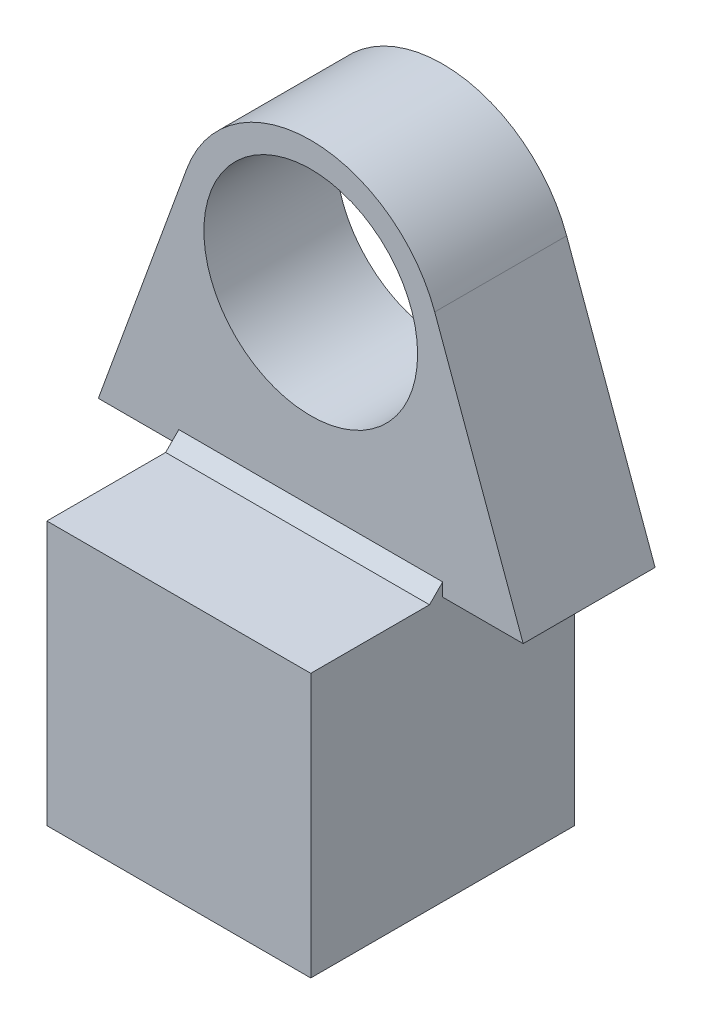
ISO-10303-21;
HEADER;
FILE_DESCRIPTION(('STEP AP214'),'2;1');
FILE_NAME('part.step','',(''),(''),'','','');
FILE_SCHEMA(('AUTOMOTIVE_DESIGN { 1 0 10303 214 1 1 1 1 }'));
ENDSEC;
DATA;
#1=APPLICATION_CONTEXT('core data for automotive mechanical design processes');
#2=APPLICATION_PROTOCOL_DEFINITION('international standard','automotive_design',2000,#1);
#3=PRODUCT_CONTEXT('',#1,'mechanical');
#4=PRODUCT('Part','Part','',(#3));
#5=PRODUCT_RELATED_PRODUCT_CATEGORY('part','',(#4));
#6=PRODUCT_DEFINITION_FORMATION('','',#4);
#7=PRODUCT_DEFINITION_CONTEXT('part definition',#1,'design');
#8=PRODUCT_DEFINITION('design','',#6,#7);
#9=PRODUCT_DEFINITION_SHAPE('','',#8);
#10=(LENGTH_UNIT() NAMED_UNIT(*) SI_UNIT(.MILLI.,.METRE.));
#11=(NAMED_UNIT(*) PLANE_ANGLE_UNIT() SI_UNIT($,.RADIAN.));
#12=(NAMED_UNIT(*) SI_UNIT($,.STERADIAN.) SOLID_ANGLE_UNIT());
#13=UNCERTAINTY_MEASURE_WITH_UNIT(LENGTH_MEASURE(1.E-05),#10,'distance_accuracy_value','');
#14=(GEOMETRIC_REPRESENTATION_CONTEXT(3) GLOBAL_UNCERTAINTY_ASSIGNED_CONTEXT((#13)) GLOBAL_UNIT_ASSIGNED_CONTEXT((#10,
#11,#12)) REPRESENTATION_CONTEXT('',''));
#15=CARTESIAN_POINT('',(0.,0.,0.));
#16=DIRECTION('',(0.,0.,1.));
#17=DIRECTION('',(1.,0.,0.));
#18=AXIS2_PLACEMENT_3D('',#15,#16,#17);
#19=CARTESIAN_POINT('',(0.,-15.,-10.));
#20=DIRECTION('',(0.,-1.,0.));
#21=DIRECTION('',(1.,0.,0.));
#22=AXIS2_PLACEMENT_3D('',#19,#20,#21);
#23=PLANE('',#22);
#24=DIRECTION('',(0.,0.,1.));
#25=VECTOR('',#24,1.);
#26=CARTESIAN_POINT('',(16.1013312387521,-15.,-10.));
#27=LINE('',#26,#25);
#28=CARTESIAN_POINT('',(16.1013312387521,-15.,-10.));
#29=VERTEX_POINT('',#28);
#30=CARTESIAN_POINT('',(16.1013312387521,-15.,0.));
#31=VERTEX_POINT('',#30);
#32=EDGE_CURVE('E140',#29,#31,#27,.T.);
#33=ORIENTED_EDGE('',*,*,#32,.T.);
#34=DIRECTION('',(-1.,0.,0.));
#35=VECTOR('',#34,1.);
#36=CARTESIAN_POINT('',(-16.1013312387521,-15.,0.));
#37=LINE('',#36,#35);
#38=CARTESIAN_POINT('',(10.,-15.,0.));
#39=VERTEX_POINT('',#38);
#40=EDGE_CURVE('E121',#31,#39,#37,.T.);
#41=ORIENTED_EDGE('',*,*,#40,.T.);
#42=DIRECTION('',(0.,0.,1.));
#43=VECTOR('',#42,1.);
#44=CARTESIAN_POINT('',(10.,-15.,-10.));
#45=LINE('',#44,#43);
#46=CARTESIAN_POINT('',(10.,-15.,-10.));
#47=VERTEX_POINT('',#46);
#48=EDGE_CURVE('E203',#47,#39,#45,.T.);
#49=ORIENTED_EDGE('',*,*,#48,.F.);
#50=DIRECTION('',(1.,0.,0.));
#51=VECTOR('',#50,1.);
#52=CARTESIAN_POINT('',(0.,-15.,-10.));
#53=LINE('',#52,#51);
#54=EDGE_CURVE('E147',#47,#29,#53,.T.);
#55=ORIENTED_EDGE('',*,*,#54,.T.);
#56=EDGE_LOOP('',(#33,#41,#49,#55));
#57=FACE_BOUND('',#56,.T.);
#58=ADVANCED_FACE('F41',(#57),#23,.T.);
#59=CARTESIAN_POINT('',(0.,0.,-10.));
#60=DIRECTION('',(0.,0.,1.));
#61=DIRECTION('',(1.,0.,0.));
#62=AXIS2_PLACEMENT_3D('',#59,#60,#61);
#63=CYLINDRICAL_SURFACE('',#62,10.);
#64=CARTESIAN_POINT('',(0.,0.,0.));
#65=DIRECTION('',(0.,0.,1.));
#66=DIRECTION('',(1.,0.,0.));
#67=AXIS2_PLACEMENT_3D('',#64,#65,#66);
#68=CIRCLE('',#67,10.);
#69=CARTESIAN_POINT('',(-9.3969262078591,3.42020143325666,0.));
#70=VERTEX_POINT('',#69);
#71=CARTESIAN_POINT('',(9.39692620785909,3.42020143325666,0.));
#72=VERTEX_POINT('',#71);
#73=EDGE_CURVE('E144',#70,#72,#68,.F.);
#74=ORIENTED_EDGE('',*,*,#73,.T.);
#75=DIRECTION('',(0.,0.,1.));
#76=VECTOR('',#75,1.);
#77=CARTESIAN_POINT('',(9.39692620785909,3.42020143325666,-10.));
#78=LINE('',#77,#76);
#79=CARTESIAN_POINT('',(9.39692620785909,3.42020143325666,-10.));
#80=VERTEX_POINT('',#79);
#81=EDGE_CURVE('E141',#80,#72,#78,.T.);
#82=ORIENTED_EDGE('',*,*,#81,.F.);
#83=CARTESIAN_POINT('',(0.,0.,-10.));
#84=DIRECTION('',(0.,0.,1.));
#85=DIRECTION('',(1.,0.,0.));
#86=AXIS2_PLACEMENT_3D('',#83,#84,#85);
#87=CIRCLE('',#86,10.);
#88=CARTESIAN_POINT('',(-9.3969262078591,3.42020143325666,-10.));
#89=VERTEX_POINT('',#88);
#90=EDGE_CURVE('E242',#80,#89,#87,.T.);
#91=ORIENTED_EDGE('',*,*,#90,.T.);
#92=DIRECTION('',(0.,0.,1.));
#93=VECTOR('',#92,1.);
#94=CARTESIAN_POINT('',(-9.3969262078591,3.42020143325666,-10.));
#95=LINE('',#94,#93);
#96=EDGE_CURVE('E157',#89,#70,#95,.T.);
#97=ORIENTED_EDGE('',*,*,#96,.T.);
#98=EDGE_LOOP('',(#74,#82,#91,#97));
#99=FACE_BOUND('',#98,.T.);
#100=ADVANCED_FACE('F261',(#99),#63,.T.);
#101=CARTESIAN_POINT('',(9.39692620785909,3.42020143325666,-10.));
#102=DIRECTION('',(-0.939692620785909,-0.342020143325666,0.));
#103=DIRECTION('',(0.342020143325666,-0.939692620785909,0.));
#104=AXIS2_PLACEMENT_3D('',#101,#102,#103);
#105=PLANE('',#104);
#106=DIRECTION('',(-0.342020143325666,0.939692620785909,0.));
#107=VECTOR('',#106,1.);
#108=CARTESIAN_POINT('',(9.39692620785909,3.42020143325666,0.));
#109=LINE('',#108,#107);
#110=EDGE_CURVE('E125',#31,#72,#109,.T.);
#111=ORIENTED_EDGE('',*,*,#110,.F.);
#112=ORIENTED_EDGE('',*,*,#32,.F.);
#113=DIRECTION('',(0.342020143325666,-0.939692620785909,0.));
#114=VECTOR('',#113,1.);
#115=CARTESIAN_POINT('',(9.39692620785909,3.42020143325666,-10.));
#116=LINE('',#115,#114);
#117=EDGE_CURVE('E164',#80,#29,#116,.T.);
#118=ORIENTED_EDGE('',*,*,#117,.F.);
#119=ORIENTED_EDGE('',*,*,#81,.T.);
#120=EDGE_LOOP('',(#111,#112,#118,#119));
#121=FACE_BOUND('',#120,.T.);
#122=ADVANCED_FACE('F138',(#121),#105,.F.);
#123=DIRECTION('',(0.,0.,-1.));
#124=VECTOR('',#123,1.);
#125=CARTESIAN_POINT('',(-10.,-15.,-10.));
#126=LINE('',#125,#124);
#127=CARTESIAN_POINT('',(-10.,-15.,0.));
#128=VERTEX_POINT('',#127);
#129=CARTESIAN_POINT('',(-10.,-15.,-10.));
#130=VERTEX_POINT('',#129);
#131=EDGE_CURVE('E221',#128,#130,#126,.T.);
#132=ORIENTED_EDGE('',*,*,#131,.F.);
#133=CARTESIAN_POINT('',(-16.1013312387521,-15.,0.));
#134=VERTEX_POINT('',#133);
#135=EDGE_CURVE('E134',#128,#134,#37,.T.);
#136=ORIENTED_EDGE('',*,*,#135,.T.);
#137=DIRECTION('',(0.,0.,1.));
#138=VECTOR('',#137,1.);
#139=CARTESIAN_POINT('',(-16.1013312387521,-15.,-10.));
#140=LINE('',#139,#138);
#141=CARTESIAN_POINT('',(-16.1013312387521,-15.,-10.));
#142=VERTEX_POINT('',#141);
#143=EDGE_CURVE('E150',#142,#134,#140,.T.);
#144=ORIENTED_EDGE('',*,*,#143,.F.);
#145=EDGE_CURVE('E249',#142,#130,#53,.T.);
#146=ORIENTED_EDGE('',*,*,#145,.T.);
#147=EDGE_LOOP('',(#132,#136,#144,#146));
#148=FACE_BOUND('',#147,.T.);
#149=ADVANCED_FACE('F266',(#148),#23,.T.);
#150=CARTESIAN_POINT('',(-9.3969262078591,3.42020143325666,-10.));
#151=DIRECTION('',(0.93969262078591,-0.342020143325665,0.));
#152=DIRECTION('',(0.342020143325665,0.93969262078591,0.));
#153=AXIS2_PLACEMENT_3D('',#150,#151,#152);
#154=PLANE('',#153);
#155=DIRECTION('',(-0.342020143325665,-0.93969262078591,0.));
#156=VECTOR('',#155,1.);
#157=CARTESIAN_POINT('',(-9.3969262078591,3.42020143325666,0.));
#158=LINE('',#157,#156);
#159=EDGE_CURVE('E192',#70,#134,#158,.T.);
#160=ORIENTED_EDGE('',*,*,#159,.F.);
#161=ORIENTED_EDGE('',*,*,#96,.F.);
#162=DIRECTION('',(0.342020143325665,0.93969262078591,0.));
#163=VECTOR('',#162,1.);
#164=CARTESIAN_POINT('',(-9.3969262078591,3.42020143325666,-10.));
#165=LINE('',#164,#163);
#166=EDGE_CURVE('E246',#142,#89,#165,.T.);
#167=ORIENTED_EDGE('',*,*,#166,.F.);
#168=ORIENTED_EDGE('',*,*,#143,.T.);
#169=EDGE_LOOP('',(#160,#161,#167,#168));
#170=FACE_BOUND('',#169,.T.);
#171=ADVANCED_FACE('F264',(#170),#154,.F.);
#172=CARTESIAN_POINT('',(0.,0.,-10.));
#173=DIRECTION('',(0.,0.,1.));
#174=DIRECTION('',(1.,0.,0.));
#175=AXIS2_PLACEMENT_3D('',#172,#173,#174);
#176=CYLINDRICAL_SURFACE('',#175,8.1);
#177=CARTESIAN_POINT('',(0.,0.,-10.));
#178=DIRECTION('',(0.,0.,1.));
#179=DIRECTION('',(1.,0.,0.));
#180=AXIS2_PLACEMENT_3D('',#177,#178,#179);
#181=CIRCLE('',#180,8.1);
#182=CARTESIAN_POINT('',(8.1,0.,-10.));
#183=VERTEX_POINT('',#182);
#184=EDGE_CURVE('E238',#183,#183,#181,.T.);
#185=ORIENTED_EDGE('',*,*,#184,.F.);
#186=EDGE_LOOP('',(#185));
#187=FACE_BOUND('',#186,.T.);
#188=CARTESIAN_POINT('',(0.,0.,0.));
#189=DIRECTION('',(0.,0.,1.));
#190=DIRECTION('',(1.,0.,0.));
#191=AXIS2_PLACEMENT_3D('',#188,#189,#190);
#192=CIRCLE('',#191,8.1);
#193=CARTESIAN_POINT('',(8.1,0.,0.));
#194=VERTEX_POINT('',#193);
#195=EDGE_CURVE('E143',#194,#194,#192,.F.);
#196=ORIENTED_EDGE('',*,*,#195,.F.);
#197=EDGE_LOOP('',(#196));
#198=FACE_BOUND('',#197,.T.);
#199=ADVANCED_FACE('F288',(#187,#198),#176,.F.);
#200=CARTESIAN_POINT('',(0.,0.,-10.));
#201=DIRECTION('',(0.,0.,1.));
#202=DIRECTION('',(1.,0.,0.));
#203=AXIS2_PLACEMENT_3D('',#200,#201,#202);
#204=PLANE('',#203);
#205=ORIENTED_EDGE('',*,*,#184,.T.);
#206=EDGE_LOOP('',(#205));
#207=FACE_BOUND('',#206,.T.);
#208=ORIENTED_EDGE('',*,*,#90,.F.);
#209=ORIENTED_EDGE('',*,*,#117,.T.);
#210=ORIENTED_EDGE('',*,*,#54,.F.);
#211=DIRECTION('',(0.,1.,0.));
#212=VECTOR('',#211,1.);
#213=CARTESIAN_POINT('',(10.,-35.,-10.));
#214=LINE('',#213,#212);
#215=CARTESIAN_POINT('',(10.,-35.,-10.));
#216=VERTEX_POINT('',#215);
#217=EDGE_CURVE('E218',#216,#47,#214,.T.);
#218=ORIENTED_EDGE('',*,*,#217,.F.);
#219=DIRECTION('',(1.,0.,0.));
#220=VECTOR('',#219,1.);
#221=CARTESIAN_POINT('',(10.,-35.,-10.));
#222=LINE('',#221,#220);
#223=CARTESIAN_POINT('',(-10.,-35.,-10.));
#224=VERTEX_POINT('',#223);
#225=EDGE_CURVE('E215',#224,#216,#222,.T.);
#226=ORIENTED_EDGE('',*,*,#225,.F.);
#227=DIRECTION('',(0.,1.,0.));
#228=VECTOR('',#227,1.);
#229=CARTESIAN_POINT('',(-10.,-35.,-10.));
#230=LINE('',#229,#228);
#231=EDGE_CURVE('E227',#224,#130,#230,.T.);
#232=ORIENTED_EDGE('',*,*,#231,.T.);
#233=ORIENTED_EDGE('',*,*,#145,.F.);
#234=ORIENTED_EDGE('',*,*,#166,.T.);
#235=EDGE_LOOP('',(#208,#209,#210,#218,#226,#232,#233,#234));
#236=FACE_BOUND('',#235,.T.);
#237=ADVANCED_FACE('F255',(#207,#236),#204,.F.);
#238=CARTESIAN_POINT('',(0.,0.,10.));
#239=DIRECTION('',(0.,0.,1.));
#240=DIRECTION('',(1.,0.,0.));
#241=AXIS2_PLACEMENT_3D('',#238,#239,#240);
#242=PLANE('',#241);
#243=DIRECTION('',(1.,0.,0.));
#244=VECTOR('',#243,1.);
#245=CARTESIAN_POINT('',(-16.1013312387521,-15.,10.));
#246=LINE('',#245,#244);
#247=CARTESIAN_POINT('',(-10.,-15.,10.));
#248=VERTEX_POINT('',#247);
#249=CARTESIAN_POINT('',(10.,-15.,10.));
#250=VERTEX_POINT('',#249);
#251=EDGE_CURVE('E189',#248,#250,#246,.T.);
#252=ORIENTED_EDGE('',*,*,#251,.F.);
#253=DIRECTION('',(0.,1.,0.));
#254=VECTOR('',#253,1.);
#255=CARTESIAN_POINT('',(-10.,-35.,10.));
#256=LINE('',#255,#254);
#257=CARTESIAN_POINT('',(-10.,-35.,10.));
#258=VERTEX_POINT('',#257);
#259=EDGE_CURVE('E231',#258,#248,#256,.T.);
#260=ORIENTED_EDGE('',*,*,#259,.F.);
#261=DIRECTION('',(-1.,0.,0.));
#262=VECTOR('',#261,1.);
#263=CARTESIAN_POINT('',(10.,-35.,10.));
#264=LINE('',#263,#262);
#265=CARTESIAN_POINT('',(10.,-35.,10.));
#266=VERTEX_POINT('',#265);
#267=EDGE_CURVE('E208',#266,#258,#264,.T.);
#268=ORIENTED_EDGE('',*,*,#267,.F.);
#269=DIRECTION('',(0.,1.,0.));
#270=VECTOR('',#269,1.);
#271=CARTESIAN_POINT('',(10.,-35.,10.));
#272=LINE('',#271,#270);
#273=EDGE_CURVE('E235',#266,#250,#272,.T.);
#274=ORIENTED_EDGE('',*,*,#273,.T.);
#275=EDGE_LOOP('',(#252,#260,#268,#274));
#276=FACE_BOUND('',#275,.T.);
#277=ADVANCED_FACE('F280',(#276),#242,.T.);
#278=CARTESIAN_POINT('',(10.,-35.,-10.));
#279=DIRECTION('',(-1.,0.,0.));
#280=DIRECTION('',(0.,-1.,0.));
#281=AXIS2_PLACEMENT_3D('',#278,#279,#280);
#282=PLANE('',#281);
#283=ORIENTED_EDGE('',*,*,#48,.T.);
#284=DIRECTION('',(0.,-1.,0.));
#285=VECTOR('',#284,1.);
#286=CARTESIAN_POINT('',(10.,0.,0.));
#287=LINE('',#286,#285);
#288=CARTESIAN_POINT('',(10.,-14.,0.));
#289=VERTEX_POINT('',#288);
#290=EDGE_CURVE('E128',#289,#39,#287,.T.);
#291=ORIENTED_EDGE('',*,*,#290,.F.);
#292=DIRECTION('',(0.,-0.707106781186544,0.707106781186551));
#293=VECTOR('',#292,1.);
#294=CARTESIAN_POINT('',(10.,-19.4999999999999,5.49999999999994));
#295=LINE('',#294,#293);
#296=CARTESIAN_POINT('',(10.,-15.,0.999999999999994));
#297=VERTEX_POINT('',#296);
#298=EDGE_CURVE('E11',#289,#297,#295,.T.);
#299=ORIENTED_EDGE('',*,*,#298,.T.);
#300=DIRECTION('',(0.,0.,1.));
#301=VECTOR('',#300,1.);
#302=CARTESIAN_POINT('',(10.,-15.,-10.));
#303=LINE('',#302,#301);
#304=EDGE_CURVE('E133',#297,#250,#303,.T.);
#305=ORIENTED_EDGE('',*,*,#304,.T.);
#306=ORIENTED_EDGE('',*,*,#273,.F.);
#307=DIRECTION('',(0.,0.,1.));
#308=VECTOR('',#307,1.);
#309=CARTESIAN_POINT('',(10.,-35.,-10.));
#310=LINE('',#309,#308);
#311=EDGE_CURVE('E204',#216,#266,#310,.T.);
#312=ORIENTED_EDGE('',*,*,#311,.F.);
#313=ORIENTED_EDGE('',*,*,#217,.T.);
#314=EDGE_LOOP('',(#283,#291,#299,#305,#306,#312,#313));
#315=FACE_BOUND('',#314,.T.);
#316=ADVANCED_FACE('F183',(#315),#282,.F.);
#317=CARTESIAN_POINT('',(-10.,-35.,-10.));
#318=DIRECTION('',(1.,0.,0.));
#319=DIRECTION('',(0.,1.,0.));
#320=AXIS2_PLACEMENT_3D('',#317,#318,#319);
#321=PLANE('',#320);
#322=CARTESIAN_POINT('',(-10.,-15.,0.999999999999994));
#323=VERTEX_POINT('',#322);
#324=EDGE_CURVE('E209',#248,#323,#126,.T.);
#325=ORIENTED_EDGE('',*,*,#324,.T.);
#326=DIRECTION('',(0.,0.707106781186544,-0.707106781186551));
#327=VECTOR('',#326,1.);
#328=CARTESIAN_POINT('',(-10.,-19.4999999999999,5.49999999999994));
#329=LINE('',#328,#327);
#330=CARTESIAN_POINT('',(-10.,-14.,0.));
#331=VERTEX_POINT('',#330);
#332=EDGE_CURVE('E50',#323,#331,#329,.T.);
#333=ORIENTED_EDGE('',*,*,#332,.T.);
#334=DIRECTION('',(0.,1.,0.));
#335=VECTOR('',#334,1.);
#336=CARTESIAN_POINT('',(-10.,0.,0.));
#337=LINE('',#336,#335);
#338=EDGE_CURVE('E57',#128,#331,#337,.T.);
#339=ORIENTED_EDGE('',*,*,#338,.F.);
#340=ORIENTED_EDGE('',*,*,#131,.T.);
#341=ORIENTED_EDGE('',*,*,#231,.F.);
#342=DIRECTION('',(0.,0.,-1.));
#343=VECTOR('',#342,1.);
#344=CARTESIAN_POINT('',(-10.,-35.,-10.));
#345=LINE('',#344,#343);
#346=EDGE_CURVE('E212',#258,#224,#345,.T.);
#347=ORIENTED_EDGE('',*,*,#346,.F.);
#348=ORIENTED_EDGE('',*,*,#259,.T.);
#349=EDGE_LOOP('',(#325,#333,#339,#340,#341,#347,#348));
#350=FACE_BOUND('',#349,.T.);
#351=ADVANCED_FACE('F272',(#350),#321,.F.);
#352=CARTESIAN_POINT('',(0.,-35.,0.));
#353=DIRECTION('',(0.,-1.,0.));
#354=DIRECTION('',(0.,0.,-1.));
#355=AXIS2_PLACEMENT_3D('',#352,#353,#354);
#356=PLANE('',#355);
#357=ORIENTED_EDGE('',*,*,#311,.T.);
#358=ORIENTED_EDGE('',*,*,#267,.T.);
#359=ORIENTED_EDGE('',*,*,#346,.T.);
#360=ORIENTED_EDGE('',*,*,#225,.T.);
#361=EDGE_LOOP('',(#357,#358,#359,#360));
#362=FACE_BOUND('',#361,.T.);
#363=ADVANCED_FACE('F277',(#362),#356,.T.);
#364=CARTESIAN_POINT('',(0.,0.,0.));
#365=DIRECTION('',(0.,0.,1.));
#366=DIRECTION('',(1.,0.,0.));
#367=AXIS2_PLACEMENT_3D('',#364,#365,#366);
#368=PLANE('',#367);
#369=ORIENTED_EDGE('',*,*,#135,.F.);
#370=ORIENTED_EDGE('',*,*,#338,.T.);
#371=DIRECTION('',(1.,0.,0.));
#372=VECTOR('',#371,1.);
#373=CARTESIAN_POINT('',(0.,-14.,0.));
#374=LINE('',#373,#372);
#375=EDGE_CURVE('E170',#331,#289,#374,.T.);
#376=ORIENTED_EDGE('',*,*,#375,.T.);
#377=ORIENTED_EDGE('',*,*,#290,.T.);
#378=ORIENTED_EDGE('',*,*,#40,.F.);
#379=ORIENTED_EDGE('',*,*,#110,.T.);
#380=ORIENTED_EDGE('',*,*,#73,.F.);
#381=ORIENTED_EDGE('',*,*,#159,.T.);
#382=EDGE_LOOP('',(#369,#370,#376,#377,#378,#379,#380,#381));
#383=FACE_BOUND('',#382,.T.);
#384=ORIENTED_EDGE('',*,*,#195,.T.);
#385=EDGE_LOOP('',(#384));
#386=FACE_BOUND('',#385,.T.);
#387=ADVANCED_FACE('F123',(#383,#386),#368,.T.);
#388=CARTESIAN_POINT('',(-16.1013312387521,-15.,-40.7677749042066));
#389=DIRECTION('',(0.,-1.,0.));
#390=DIRECTION('',(1.,0.,0.));
#391=AXIS2_PLACEMENT_3D('',#388,#389,#390);
#392=PLANE('',#391);
#393=ORIENTED_EDGE('',*,*,#304,.F.);
#394=DIRECTION('',(-1.,0.,0.));
#395=VECTOR('',#394,1.);
#396=CARTESIAN_POINT('',(-16.1013312387521,-15.,0.999999999999994));
#397=LINE('',#396,#395);
#398=EDGE_CURVE('E154',#297,#323,#397,.T.);
#399=ORIENTED_EDGE('',*,*,#398,.T.);
#400=ORIENTED_EDGE('',*,*,#324,.F.);
#401=ORIENTED_EDGE('',*,*,#251,.T.);
#402=EDGE_LOOP('',(#393,#399,#400,#401));
#403=FACE_BOUND('',#402,.T.);
#404=ADVANCED_FACE('F187',(#403),#392,.F.);
#405=CARTESIAN_POINT('',(-16.1013312387521,-15.,0.999999999999994));
#406=DIRECTION('',(0.,-0.707106781186551,-0.707106781186544));
#407=DIRECTION('',(-1.,0.,0.));
#408=AXIS2_PLACEMENT_3D('',#405,#406,#407);
#409=PLANE('',#408);
#410=ORIENTED_EDGE('',*,*,#298,.F.);
#411=ORIENTED_EDGE('',*,*,#375,.F.);
#412=ORIENTED_EDGE('',*,*,#332,.F.);
#413=ORIENTED_EDGE('',*,*,#398,.F.);
#414=EDGE_LOOP('',(#410,#411,#412,#413));
#415=FACE_BOUND('',#414,.T.);
#416=ADVANCED_FACE('F43',(#415),#409,.F.);
#417=CLOSED_SHELL('',(#58,#100,#122,#149,#171,#199,#237,#277,#316,#351,#363,#387,#404,#416));
#418=MANIFOLD_SOLID_BREP('B2',#417);
#419=ADVANCED_BREP_SHAPE_REPRESENTATION('',(#18,#418),#14);
#420=SHAPE_DEFINITION_REPRESENTATION(#9,#419);
ENDSEC;
END-ISO-10303-21;
